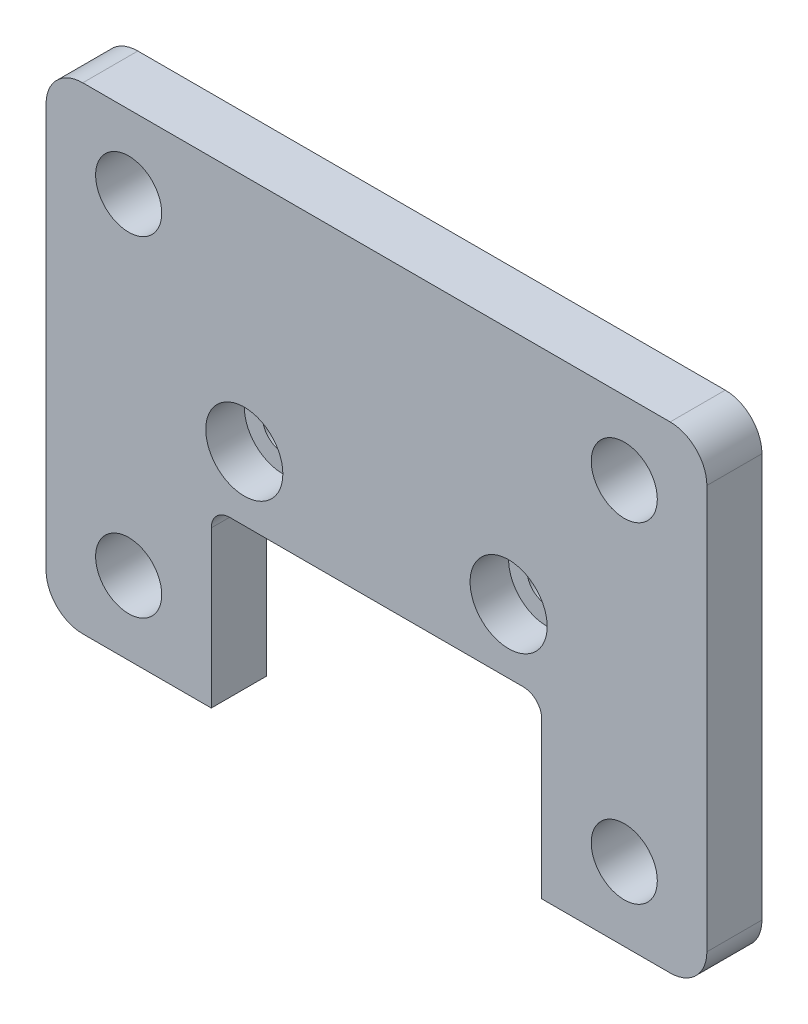
ISO-10303-21;
HEADER;
FILE_DESCRIPTION(('STEP AP214'),'2;1');
FILE_NAME('part.step','',(''),(''),'','','');
FILE_SCHEMA(('AUTOMOTIVE_DESIGN { 1 0 10303 214 1 1 1 1 }'));
ENDSEC;
DATA;
#1=APPLICATION_CONTEXT('core data for automotive mechanical design processes');
#2=APPLICATION_PROTOCOL_DEFINITION('international standard','automotive_design',2000,#1);
#3=PRODUCT_CONTEXT('',#1,'mechanical');
#4=PRODUCT('Part','Part','',(#3));
#5=PRODUCT_RELATED_PRODUCT_CATEGORY('part','',(#4));
#6=PRODUCT_DEFINITION_FORMATION('','',#4);
#7=PRODUCT_DEFINITION_CONTEXT('part definition',#1,'design');
#8=PRODUCT_DEFINITION('design','',#6,#7);
#9=PRODUCT_DEFINITION_SHAPE('','',#8);
#10=(LENGTH_UNIT() NAMED_UNIT(*) SI_UNIT(.MILLI.,.METRE.));
#11=(NAMED_UNIT(*) PLANE_ANGLE_UNIT() SI_UNIT($,.RADIAN.));
#12=(NAMED_UNIT(*) SI_UNIT($,.STERADIAN.) SOLID_ANGLE_UNIT());
#13=UNCERTAINTY_MEASURE_WITH_UNIT(LENGTH_MEASURE(1.E-05),#10,'distance_accuracy_value','');
#14=(GEOMETRIC_REPRESENTATION_CONTEXT(3) GLOBAL_UNCERTAINTY_ASSIGNED_CONTEXT((#13)) GLOBAL_UNIT_ASSIGNED_CONTEXT((#10,
#11,#12)) REPRESENTATION_CONTEXT('',''));
#15=CARTESIAN_POINT('',(0.,0.,0.));
#16=DIRECTION('',(0.,0.,1.));
#17=DIRECTION('',(1.,0.,0.));
#18=AXIS2_PLACEMENT_3D('',#15,#16,#17);
#19=CARTESIAN_POINT('',(7.2,0.,8.));
#20=DIRECTION('',(0.,0.,-1.));
#21=DIRECTION('',(-1.,0.,0.));
#22=AXIS2_PLACEMENT_3D('',#19,#20,#21);
#23=CYLINDRICAL_SURFACE('',#22,1.1);
#24=CARTESIAN_POINT('',(7.2,0.,0.));
#25=DIRECTION('',(0.,0.,1.));
#26=DIRECTION('',(1.,0.,0.));
#27=AXIS2_PLACEMENT_3D('',#24,#25,#26);
#28=CIRCLE('',#27,1.1);
#29=CARTESIAN_POINT('',(8.3,0.,0.));
#30=VERTEX_POINT('',#29);
#31=EDGE_CURVE('E190',#30,#30,#28,.T.);
#32=ORIENTED_EDGE('',*,*,#31,.F.);
#33=EDGE_LOOP('',(#32));
#34=FACE_BOUND('',#33,.T.);
#35=CARTESIAN_POINT('',(7.2,0.,5.9));
#36=DIRECTION('',(0.,0.,1.));
#37=DIRECTION('',(1.,0.,0.));
#38=AXIS2_PLACEMENT_3D('',#35,#36,#37);
#39=CIRCLE('',#38,1.1);
#40=CARTESIAN_POINT('',(8.3,0.,5.9));
#41=VERTEX_POINT('',#40);
#42=EDGE_CURVE('E39',#41,#41,#39,.T.);
#43=ORIENTED_EDGE('',*,*,#42,.T.);
#44=EDGE_LOOP('',(#43));
#45=FACE_BOUND('',#44,.T.);
#46=ADVANCED_FACE('F35',(#34,#45),#23,.F.);
#47=CARTESIAN_POINT('',(-7.2,0.,8.));
#48=DIRECTION('',(0.,0.,-1.));
#49=DIRECTION('',(-1.,0.,0.));
#50=AXIS2_PLACEMENT_3D('',#47,#48,#49);
#51=CYLINDRICAL_SURFACE('',#50,1.1);
#52=CARTESIAN_POINT('',(-7.2,0.,0.));
#53=DIRECTION('',(0.,0.,1.));
#54=DIRECTION('',(1.,0.,0.));
#55=AXIS2_PLACEMENT_3D('',#52,#53,#54);
#56=CIRCLE('',#55,1.1);
#57=CARTESIAN_POINT('',(-6.1,0.,0.));
#58=VERTEX_POINT('',#57);
#59=EDGE_CURVE('E209',#58,#58,#56,.T.);
#60=ORIENTED_EDGE('',*,*,#59,.F.);
#61=EDGE_LOOP('',(#60));
#62=FACE_BOUND('',#61,.T.);
#63=CARTESIAN_POINT('',(-7.2,0.,5.9));
#64=DIRECTION('',(0.,0.,1.));
#65=DIRECTION('',(1.,0.,0.));
#66=AXIS2_PLACEMENT_3D('',#63,#64,#65);
#67=CIRCLE('',#66,1.1);
#68=CARTESIAN_POINT('',(-6.1,0.,5.9));
#69=VERTEX_POINT('',#68);
#70=EDGE_CURVE('E184',#69,#69,#67,.T.);
#71=ORIENTED_EDGE('',*,*,#70,.T.);
#72=EDGE_LOOP('',(#71));
#73=FACE_BOUND('',#72,.T.);
#74=ADVANCED_FACE('F351',(#62,#73),#51,.F.);
#75=CARTESIAN_POINT('',(-16.,-13.,8.));
#76=DIRECTION('',(0.,1.,0.));
#77=DIRECTION('',(0.,0.,1.));
#78=AXIS2_PLACEMENT_3D('',#75,#76,#77);
#79=PLANE('',#78);
#80=DIRECTION('',(0.,0.,1.));
#81=VECTOR('',#80,1.);
#82=CARTESIAN_POINT('',(9.,-13.,8.));
#83=LINE('',#82,#81);
#84=CARTESIAN_POINT('',(9.,-13.,5.));
#85=VERTEX_POINT('',#84);
#86=CARTESIAN_POINT('',(9.,-13.,8.));
#87=VERTEX_POINT('',#86);
#88=EDGE_CURVE('E151',#85,#87,#83,.T.);
#89=ORIENTED_EDGE('',*,*,#88,.F.);
#90=DIRECTION('',(1.,0.,0.));
#91=VECTOR('',#90,1.);
#92=CARTESIAN_POINT('',(-16.,-13.,5.));
#93=LINE('',#92,#91);
#94=CARTESIAN_POINT('',(16.,-13.,5.));
#95=VERTEX_POINT('',#94);
#96=EDGE_CURVE('E150',#85,#95,#93,.T.);
#97=ORIENTED_EDGE('',*,*,#96,.T.);
#98=DIRECTION('',(0.,0.,-1.));
#99=VECTOR('',#98,1.);
#100=CARTESIAN_POINT('',(16.,-13.,8.));
#101=LINE('',#100,#99);
#102=CARTESIAN_POINT('',(16.,-13.,8.));
#103=VERTEX_POINT('',#102);
#104=EDGE_CURVE('E175',#103,#95,#101,.T.);
#105=ORIENTED_EDGE('',*,*,#104,.F.);
#106=DIRECTION('',(1.,0.,0.));
#107=VECTOR('',#106,1.);
#108=CARTESIAN_POINT('',(-16.,-13.,8.));
#109=LINE('',#108,#107);
#110=EDGE_CURVE('E273',#87,#103,#109,.T.);
#111=ORIENTED_EDGE('',*,*,#110,.F.);
#112=EDGE_LOOP('',(#89,#97,#105,#111));
#113=FACE_BOUND('',#112,.T.);
#114=ADVANCED_FACE('F339',(#113),#79,.F.);
#115=DIRECTION('',(0.,0.,-1.));
#116=VECTOR('',#115,1.);
#117=CARTESIAN_POINT('',(-9.,-13.,8.));
#118=LINE('',#117,#116);
#119=CARTESIAN_POINT('',(-9.,-13.,8.));
#120=VERTEX_POINT('',#119);
#121=CARTESIAN_POINT('',(-9.,-13.,5.));
#122=VERTEX_POINT('',#121);
#123=EDGE_CURVE('E52',#120,#122,#118,.T.);
#124=ORIENTED_EDGE('',*,*,#123,.F.);
#125=CARTESIAN_POINT('',(-16.,-13.,8.));
#126=VERTEX_POINT('',#125);
#127=EDGE_CURVE('E102',#126,#120,#109,.T.);
#128=ORIENTED_EDGE('',*,*,#127,.F.);
#129=DIRECTION('',(0.,0.,-1.));
#130=VECTOR('',#129,1.);
#131=CARTESIAN_POINT('',(-16.,-13.,8.));
#132=LINE('',#131,#130);
#133=CARTESIAN_POINT('',(-16.,-13.,5.));
#134=VERTEX_POINT('',#133);
#135=EDGE_CURVE('E178',#126,#134,#132,.T.);
#136=ORIENTED_EDGE('',*,*,#135,.T.);
#137=EDGE_CURVE('E152',#134,#122,#93,.T.);
#138=ORIENTED_EDGE('',*,*,#137,.T.);
#139=EDGE_LOOP('',(#124,#128,#136,#138));
#140=FACE_BOUND('',#139,.T.);
#141=ADVANCED_FACE('F409',(#140),#79,.F.);
#142=CARTESIAN_POINT('',(-16.,-11.,8.));
#143=DIRECTION('',(0.,0.,1.));
#144=DIRECTION('',(1.,0.,0.));
#145=AXIS2_PLACEMENT_3D('',#142,#143,#144);
#146=PLANE('',#145);
#147=CARTESIAN_POINT('',(-13.5,9.,8.));
#148=DIRECTION('',(0.,0.,1.));
#149=DIRECTION('',(1.,0.,0.));
#150=AXIS2_PLACEMENT_3D('',#147,#148,#149);
#151=CIRCLE('',#150,1.8);
#152=CARTESIAN_POINT('',(-11.7,9.,8.));
#153=VERTEX_POINT('',#152);
#154=EDGE_CURVE('E655',#153,#153,#151,.T.);
#155=ORIENTED_EDGE('',*,*,#154,.F.);
#156=EDGE_LOOP('',(#155));
#157=FACE_BOUND('',#156,.T.);
#158=CARTESIAN_POINT('',(13.5,-9.,8.));
#159=DIRECTION('',(0.,0.,1.));
#160=DIRECTION('',(1.,0.,0.));
#161=AXIS2_PLACEMENT_3D('',#158,#159,#160);
#162=CIRCLE('',#161,1.8);
#163=CARTESIAN_POINT('',(15.3,-9.,8.));
#164=VERTEX_POINT('',#163);
#165=EDGE_CURVE('E659',#164,#164,#162,.T.);
#166=ORIENTED_EDGE('',*,*,#165,.F.);
#167=EDGE_LOOP('',(#166));
#168=FACE_BOUND('',#167,.T.);
#169=CARTESIAN_POINT('',(13.5,9.,8.));
#170=DIRECTION('',(0.,0.,1.));
#171=DIRECTION('',(1.,0.,0.));
#172=AXIS2_PLACEMENT_3D('',#169,#170,#171);
#173=CIRCLE('',#172,1.8);
#174=CARTESIAN_POINT('',(15.3,9.,8.));
#175=VERTEX_POINT('',#174);
#176=EDGE_CURVE('E668',#175,#175,#173,.T.);
#177=ORIENTED_EDGE('',*,*,#176,.F.);
#178=EDGE_LOOP('',(#177));
#179=FACE_BOUND('',#178,.T.);
#180=CARTESIAN_POINT('',(-13.5,-9.,8.));
#181=DIRECTION('',(0.,0.,1.));
#182=DIRECTION('',(1.,0.,0.));
#183=AXIS2_PLACEMENT_3D('',#180,#181,#182);
#184=CIRCLE('',#183,1.8);
#185=CARTESIAN_POINT('',(-11.7,-9.,8.));
#186=VERTEX_POINT('',#185);
#187=EDGE_CURVE('E208',#186,#186,#184,.T.);
#188=ORIENTED_EDGE('',*,*,#187,.F.);
#189=EDGE_LOOP('',(#188));
#190=FACE_BOUND('',#189,.T.);
#191=CARTESIAN_POINT('',(-7.2,0.,8.));
#192=DIRECTION('',(0.,0.,1.));
#193=DIRECTION('',(1.,0.,0.));
#194=AXIS2_PLACEMENT_3D('',#191,#192,#193);
#195=CIRCLE('',#194,2.1);
#196=CARTESIAN_POINT('',(-5.1,0.,8.));
#197=VERTEX_POINT('',#196);
#198=EDGE_CURVE('E186',#197,#197,#195,.T.);
#199=ORIENTED_EDGE('',*,*,#198,.F.);
#200=EDGE_LOOP('',(#199));
#201=FACE_BOUND('',#200,.T.);
#202=CARTESIAN_POINT('',(7.2,0.,8.));
#203=DIRECTION('',(0.,0.,1.));
#204=DIRECTION('',(1.,0.,0.));
#205=AXIS2_PLACEMENT_3D('',#202,#203,#204);
#206=CIRCLE('',#205,2.1);
#207=CARTESIAN_POINT('',(9.3,0.,8.));
#208=VERTEX_POINT('',#207);
#209=EDGE_CURVE('E197',#208,#208,#206,.T.);
#210=ORIENTED_EDGE('',*,*,#209,.F.);
#211=EDGE_LOOP('',(#210));
#212=FACE_BOUND('',#211,.T.);
#213=CARTESIAN_POINT('',(8.,-4.5,8.));
#214=DIRECTION('',(0.,0.,1.));
#215=DIRECTION('',(1.,0.,0.));
#216=AXIS2_PLACEMENT_3D('',#213,#214,#215);
#217=CIRCLE('',#216,0.999999999999996);
#218=CARTESIAN_POINT('',(9.,-4.5,8.));
#219=VERTEX_POINT('',#218);
#220=CARTESIAN_POINT('',(8.,-3.5,8.));
#221=VERTEX_POINT('',#220);
#222=EDGE_CURVE('E236',#219,#221,#217,.T.);
#223=ORIENTED_EDGE('',*,*,#222,.F.);
#224=DIRECTION('',(0.,1.,0.));
#225=VECTOR('',#224,1.);
#226=CARTESIAN_POINT('',(9.,-19.,8.));
#227=LINE('',#226,#225);
#228=EDGE_CURVE('E233',#87,#219,#227,.T.);
#229=ORIENTED_EDGE('',*,*,#228,.F.);
#230=ORIENTED_EDGE('',*,*,#110,.T.);
#231=CARTESIAN_POINT('',(16.,-11.,8.));
#232=DIRECTION('',(0.,0.,1.));
#233=DIRECTION('',(1.,0.,0.));
#234=AXIS2_PLACEMENT_3D('',#231,#232,#233);
#235=CIRCLE('',#234,1.99999999999999);
#236=CARTESIAN_POINT('',(18.,-11.,8.));
#237=VERTEX_POINT('',#236);
#238=EDGE_CURVE('E275',#103,#237,#235,.T.);
#239=ORIENTED_EDGE('',*,*,#238,.T.);
#240=DIRECTION('',(0.,1.,0.));
#241=VECTOR('',#240,1.);
#242=CARTESIAN_POINT('',(18.,-11.,8.));
#243=LINE('',#242,#241);
#244=CARTESIAN_POINT('',(18.,11.,8.));
#245=VERTEX_POINT('',#244);
#246=EDGE_CURVE('E277',#237,#245,#243,.T.);
#247=ORIENTED_EDGE('',*,*,#246,.T.);
#248=CARTESIAN_POINT('',(16.,11.,8.));
#249=DIRECTION('',(0.,0.,1.));
#250=DIRECTION('',(1.,0.,0.));
#251=AXIS2_PLACEMENT_3D('',#248,#249,#250);
#252=CIRCLE('',#251,1.99999999999999);
#253=CARTESIAN_POINT('',(16.,13.,8.));
#254=VERTEX_POINT('',#253);
#255=EDGE_CURVE('E126',#245,#254,#252,.T.);
#256=ORIENTED_EDGE('',*,*,#255,.T.);
#257=DIRECTION('',(-1.,0.,0.));
#258=VECTOR('',#257,1.);
#259=CARTESIAN_POINT('',(16.,13.,8.));
#260=LINE('',#259,#258);
#261=CARTESIAN_POINT('',(-16.,13.,8.));
#262=VERTEX_POINT('',#261);
#263=EDGE_CURVE('E118',#254,#262,#260,.T.);
#264=ORIENTED_EDGE('',*,*,#263,.T.);
#265=CARTESIAN_POINT('',(-16.,11.,8.));
#266=DIRECTION('',(0.,0.,1.));
#267=DIRECTION('',(1.,0.,0.));
#268=AXIS2_PLACEMENT_3D('',#265,#266,#267);
#269=CIRCLE('',#268,1.99999999999999);
#270=CARTESIAN_POINT('',(-18.,11.,8.));
#271=VERTEX_POINT('',#270);
#272=EDGE_CURVE('E123',#262,#271,#269,.T.);
#273=ORIENTED_EDGE('',*,*,#272,.T.);
#274=DIRECTION('',(0.,-1.,0.));
#275=VECTOR('',#274,1.);
#276=CARTESIAN_POINT('',(-18.,11.,8.));
#277=LINE('',#276,#275);
#278=CARTESIAN_POINT('',(-18.,-11.,8.));
#279=VERTEX_POINT('',#278);
#280=EDGE_CURVE('E61',#271,#279,#277,.T.);
#281=ORIENTED_EDGE('',*,*,#280,.T.);
#282=CARTESIAN_POINT('',(-16.,-11.,8.));
#283=DIRECTION('',(0.,0.,1.));
#284=DIRECTION('',(1.,0.,0.));
#285=AXIS2_PLACEMENT_3D('',#282,#283,#284);
#286=CIRCLE('',#285,1.99999999999999);
#287=EDGE_CURVE('E165',#279,#126,#286,.T.);
#288=ORIENTED_EDGE('',*,*,#287,.T.);
#289=ORIENTED_EDGE('',*,*,#127,.T.);
#290=DIRECTION('',(0.,-1.,0.));
#291=VECTOR('',#290,1.);
#292=CARTESIAN_POINT('',(-9.,-4.5,8.));
#293=LINE('',#292,#291);
#294=CARTESIAN_POINT('',(-9.,-4.5,8.));
#295=VERTEX_POINT('',#294);
#296=EDGE_CURVE('E246',#295,#120,#293,.T.);
#297=ORIENTED_EDGE('',*,*,#296,.F.);
#298=CARTESIAN_POINT('',(-8.,-4.5,8.));
#299=DIRECTION('',(0.,0.,1.));
#300=DIRECTION('',(1.,0.,0.));
#301=AXIS2_PLACEMENT_3D('',#298,#299,#300);
#302=CIRCLE('',#301,0.999999999999997);
#303=CARTESIAN_POINT('',(-8.,-3.5,8.));
#304=VERTEX_POINT('',#303);
#305=EDGE_CURVE('E243',#304,#295,#302,.T.);
#306=ORIENTED_EDGE('',*,*,#305,.F.);
#307=DIRECTION('',(-1.,0.,0.));
#308=VECTOR('',#307,1.);
#309=CARTESIAN_POINT('',(8.,-3.5,8.));
#310=LINE('',#309,#308);
#311=EDGE_CURVE('E240',#221,#304,#310,.T.);
#312=ORIENTED_EDGE('',*,*,#311,.F.);
#313=EDGE_LOOP('',(#223,#229,#230,#239,#247,#256,#264,#273,#281,#288,#289,#297,#306,#312));
#314=FACE_BOUND('',#313,.T.);
#315=ADVANCED_FACE('F121',(#157,#168,#179,#190,#201,#212,#314),#146,.T.);
#316=CARTESIAN_POINT('',(-16.,-11.,5.));
#317=DIRECTION('',(0.,0.,1.));
#318=DIRECTION('',(1.,0.,0.));
#319=AXIS2_PLACEMENT_3D('',#316,#317,#318);
#320=PLANE('',#319);
#321=CARTESIAN_POINT('',(-13.5,9.,5.));
#322=DIRECTION('',(0.,0.,1.));
#323=DIRECTION('',(1.,0.,0.));
#324=AXIS2_PLACEMENT_3D('',#321,#322,#323);
#325=CIRCLE('',#324,1.8);
#326=CARTESIAN_POINT('',(-11.7,9.,5.));
#327=VERTEX_POINT('',#326);
#328=EDGE_CURVE('E658',#327,#327,#325,.T.);
#329=ORIENTED_EDGE('',*,*,#328,.T.);
#330=EDGE_LOOP('',(#329));
#331=FACE_BOUND('',#330,.T.);
#332=CARTESIAN_POINT('',(13.5,-9.,5.));
#333=DIRECTION('',(0.,0.,1.));
#334=DIRECTION('',(1.,0.,0.));
#335=AXIS2_PLACEMENT_3D('',#332,#333,#334);
#336=CIRCLE('',#335,1.8);
#337=CARTESIAN_POINT('',(15.3,-9.,5.));
#338=VERTEX_POINT('',#337);
#339=EDGE_CURVE('E663',#338,#338,#336,.T.);
#340=ORIENTED_EDGE('',*,*,#339,.T.);
#341=EDGE_LOOP('',(#340));
#342=FACE_BOUND('',#341,.T.);
#343=CARTESIAN_POINT('',(13.5,9.,5.));
#344=DIRECTION('',(0.,0.,1.));
#345=DIRECTION('',(1.,0.,0.));
#346=AXIS2_PLACEMENT_3D('',#343,#344,#345);
#347=CIRCLE('',#346,1.8);
#348=CARTESIAN_POINT('',(15.3,9.,5.));
#349=VERTEX_POINT('',#348);
#350=EDGE_CURVE('E695',#349,#349,#347,.T.);
#351=ORIENTED_EDGE('',*,*,#350,.T.);
#352=EDGE_LOOP('',(#351));
#353=FACE_BOUND('',#352,.T.);
#354=CARTESIAN_POINT('',(-13.5,-9.,5.));
#355=DIRECTION('',(0.,0.,1.));
#356=DIRECTION('',(1.,0.,0.));
#357=AXIS2_PLACEMENT_3D('',#354,#355,#356);
#358=CIRCLE('',#357,1.8);
#359=CARTESIAN_POINT('',(-11.7,-9.,5.));
#360=VERTEX_POINT('',#359);
#361=EDGE_CURVE('E200',#360,#360,#358,.T.);
#362=ORIENTED_EDGE('',*,*,#361,.T.);
#363=EDGE_LOOP('',(#362));
#364=FACE_BOUND('',#363,.T.);
#365=CARTESIAN_POINT('',(7.2,0.,5.));
#366=DIRECTION('',(0.,0.,1.));
#367=DIRECTION('',(1.,0.,0.));
#368=AXIS2_PLACEMENT_3D('',#365,#366,#367);
#369=CIRCLE('',#368,2.75);
#370=CARTESIAN_POINT('',(9.95,0.,5.));
#371=VERTEX_POINT('',#370);
#372=EDGE_CURVE('E11',#371,#371,#369,.F.);
#373=ORIENTED_EDGE('',*,*,#372,.F.);
#374=EDGE_LOOP('',(#373));
#375=FACE_BOUND('',#374,.T.);
#376=CARTESIAN_POINT('',(-7.2,0.,5.));
#377=DIRECTION('',(0.,0.,1.));
#378=DIRECTION('',(1.,0.,0.));
#379=AXIS2_PLACEMENT_3D('',#376,#377,#378);
#380=CIRCLE('',#379,2.75);
#381=CARTESIAN_POINT('',(-4.45,0.,5.));
#382=VERTEX_POINT('',#381);
#383=EDGE_CURVE('E44',#382,#382,#380,.F.);
#384=ORIENTED_EDGE('',*,*,#383,.F.);
#385=EDGE_LOOP('',(#384));
#386=FACE_BOUND('',#385,.T.);
#387=DIRECTION('',(0.,-1.,0.));
#388=VECTOR('',#387,1.);
#389=CARTESIAN_POINT('',(9.,-11.,5.));
#390=LINE('',#389,#388);
#391=CARTESIAN_POINT('',(9.,-4.5,5.));
#392=VERTEX_POINT('',#391);
#393=EDGE_CURVE('E180',#392,#85,#390,.T.);
#394=ORIENTED_EDGE('',*,*,#393,.F.);
#395=CARTESIAN_POINT('',(8.,-4.5,5.));
#396=DIRECTION('',(0.,0.,1.));
#397=DIRECTION('',(1.,0.,0.));
#398=AXIS2_PLACEMENT_3D('',#395,#396,#397);
#399=CIRCLE('',#398,0.999999999999996);
#400=CARTESIAN_POINT('',(8.,-3.5,5.));
#401=VERTEX_POINT('',#400);
#402=EDGE_CURVE('E232',#392,#401,#399,.T.);
#403=ORIENTED_EDGE('',*,*,#402,.T.);
#404=DIRECTION('',(-1.,0.,0.));
#405=VECTOR('',#404,1.);
#406=CARTESIAN_POINT('',(8.,-3.5,5.));
#407=LINE('',#406,#405);
#408=CARTESIAN_POINT('',(-8.,-3.5,5.));
#409=VERTEX_POINT('',#408);
#410=EDGE_CURVE('E251',#401,#409,#407,.T.);
#411=ORIENTED_EDGE('',*,*,#410,.T.);
#412=CARTESIAN_POINT('',(-8.,-4.5,5.));
#413=DIRECTION('',(0.,0.,1.));
#414=DIRECTION('',(1.,0.,0.));
#415=AXIS2_PLACEMENT_3D('',#412,#413,#414);
#416=CIRCLE('',#415,0.999999999999997);
#417=CARTESIAN_POINT('',(-9.,-4.5,5.));
#418=VERTEX_POINT('',#417);
#419=EDGE_CURVE('E254',#409,#418,#416,.T.);
#420=ORIENTED_EDGE('',*,*,#419,.T.);
#421=DIRECTION('',(0.,-1.,0.));
#422=VECTOR('',#421,1.);
#423=CARTESIAN_POINT('',(-9.,-4.5,5.));
#424=LINE('',#423,#422);
#425=EDGE_CURVE('E237',#418,#122,#424,.T.);
#426=ORIENTED_EDGE('',*,*,#425,.T.);
#427=ORIENTED_EDGE('',*,*,#137,.F.);
#428=CARTESIAN_POINT('',(-16.,-11.,5.));
#429=DIRECTION('',(0.,0.,1.));
#430=DIRECTION('',(1.,0.,0.));
#431=AXIS2_PLACEMENT_3D('',#428,#429,#430);
#432=CIRCLE('',#431,1.99999999999999);
#433=CARTESIAN_POINT('',(-18.,-11.,5.));
#434=VERTEX_POINT('',#433);
#435=EDGE_CURVE('E147',#434,#134,#432,.T.);
#436=ORIENTED_EDGE('',*,*,#435,.F.);
#437=DIRECTION('',(0.,-1.,0.));
#438=VECTOR('',#437,1.);
#439=CARTESIAN_POINT('',(-18.,11.,5.));
#440=LINE('',#439,#438);
#441=CARTESIAN_POINT('',(-18.,11.,5.));
#442=VERTEX_POINT('',#441);
#443=EDGE_CURVE('E94',#442,#434,#440,.T.);
#444=ORIENTED_EDGE('',*,*,#443,.F.);
#445=CARTESIAN_POINT('',(-16.,11.,5.));
#446=DIRECTION('',(0.,0.,1.));
#447=DIRECTION('',(1.,0.,0.));
#448=AXIS2_PLACEMENT_3D('',#445,#446,#447);
#449=CIRCLE('',#448,1.99999999999999);
#450=CARTESIAN_POINT('',(-16.,13.,5.));
#451=VERTEX_POINT('',#450);
#452=EDGE_CURVE('E162',#451,#442,#449,.T.);
#453=ORIENTED_EDGE('',*,*,#452,.F.);
#454=DIRECTION('',(-1.,0.,0.));
#455=VECTOR('',#454,1.);
#456=CARTESIAN_POINT('',(16.,13.,5.));
#457=LINE('',#456,#455);
#458=CARTESIAN_POINT('',(16.,13.,5.));
#459=VERTEX_POINT('',#458);
#460=EDGE_CURVE('E135',#459,#451,#457,.T.);
#461=ORIENTED_EDGE('',*,*,#460,.F.);
#462=CARTESIAN_POINT('',(16.,11.,5.));
#463=DIRECTION('',(0.,0.,1.));
#464=DIRECTION('',(1.,0.,0.));
#465=AXIS2_PLACEMENT_3D('',#462,#463,#464);
#466=CIRCLE('',#465,1.99999999999999);
#467=CARTESIAN_POINT('',(18.,11.,5.));
#468=VERTEX_POINT('',#467);
#469=EDGE_CURVE('E159',#468,#459,#466,.T.);
#470=ORIENTED_EDGE('',*,*,#469,.F.);
#471=DIRECTION('',(0.,1.,0.));
#472=VECTOR('',#471,1.);
#473=CARTESIAN_POINT('',(18.,-11.,5.));
#474=LINE('',#473,#472);
#475=CARTESIAN_POINT('',(18.,-11.,5.));
#476=VERTEX_POINT('',#475);
#477=EDGE_CURVE('E157',#476,#468,#474,.T.);
#478=ORIENTED_EDGE('',*,*,#477,.F.);
#479=CARTESIAN_POINT('',(16.,-11.,5.));
#480=DIRECTION('',(0.,0.,1.));
#481=DIRECTION('',(1.,0.,0.));
#482=AXIS2_PLACEMENT_3D('',#479,#480,#481);
#483=CIRCLE('',#482,1.99999999999999);
#484=EDGE_CURVE('E155',#95,#476,#483,.T.);
#485=ORIENTED_EDGE('',*,*,#484,.F.);
#486=ORIENTED_EDGE('',*,*,#96,.F.);
#487=EDGE_LOOP('',(#394,#403,#411,#420,#426,#427,#436,#444,#453,#461,#470,#478,#485,#486));
#488=FACE_BOUND('',#487,.T.);
#489=ADVANCED_FACE('F290',(#331,#342,#353,#364,#375,#386,#488),#320,.F.);
#490=CARTESIAN_POINT('',(-16.,-11.,8.));
#491=DIRECTION('',(0.,0.,-1.));
#492=DIRECTION('',(-1.,0.,0.));
#493=AXIS2_PLACEMENT_3D('',#490,#491,#492);
#494=CYLINDRICAL_SURFACE('',#493,1.99999999999999);
#495=ORIENTED_EDGE('',*,*,#435,.T.);
#496=ORIENTED_EDGE('',*,*,#135,.F.);
#497=ORIENTED_EDGE('',*,*,#287,.F.);
#498=DIRECTION('',(0.,0.,-1.));
#499=VECTOR('',#498,1.);
#500=CARTESIAN_POINT('',(-18.,-11.,8.));
#501=LINE('',#500,#499);
#502=EDGE_CURVE('E143',#279,#434,#501,.T.);
#503=ORIENTED_EDGE('',*,*,#502,.T.);
#504=EDGE_LOOP('',(#495,#496,#497,#503));
#505=FACE_BOUND('',#504,.T.);
#506=ADVANCED_FACE('F37',(#505),#494,.T.);
#507=CARTESIAN_POINT('',(16.,-11.,8.));
#508=DIRECTION('',(0.,0.,-1.));
#509=DIRECTION('',(-1.,0.,0.));
#510=AXIS2_PLACEMENT_3D('',#507,#508,#509);
#511=CYLINDRICAL_SURFACE('',#510,1.99999999999999);
#512=ORIENTED_EDGE('',*,*,#484,.T.);
#513=DIRECTION('',(0.,0.,-1.));
#514=VECTOR('',#513,1.);
#515=CARTESIAN_POINT('',(18.,-11.,8.));
#516=LINE('',#515,#514);
#517=EDGE_CURVE('E172',#237,#476,#516,.T.);
#518=ORIENTED_EDGE('',*,*,#517,.F.);
#519=ORIENTED_EDGE('',*,*,#238,.F.);
#520=ORIENTED_EDGE('',*,*,#104,.T.);
#521=EDGE_LOOP('',(#512,#518,#519,#520));
#522=FACE_BOUND('',#521,.T.);
#523=ADVANCED_FACE('F342',(#522),#511,.T.);
#524=CARTESIAN_POINT('',(18.,-11.,8.));
#525=DIRECTION('',(-1.,0.,0.));
#526=DIRECTION('',(0.,0.,1.));
#527=AXIS2_PLACEMENT_3D('',#524,#525,#526);
#528=PLANE('',#527);
#529=ORIENTED_EDGE('',*,*,#477,.T.);
#530=DIRECTION('',(0.,0.,-1.));
#531=VECTOR('',#530,1.);
#532=CARTESIAN_POINT('',(18.,11.,8.));
#533=LINE('',#532,#531);
#534=EDGE_CURVE('E169',#245,#468,#533,.T.);
#535=ORIENTED_EDGE('',*,*,#534,.F.);
#536=ORIENTED_EDGE('',*,*,#246,.F.);
#537=ORIENTED_EDGE('',*,*,#517,.T.);
#538=EDGE_LOOP('',(#529,#535,#536,#537));
#539=FACE_BOUND('',#538,.T.);
#540=ADVANCED_FACE('F283',(#539),#528,.F.);
#541=CARTESIAN_POINT('',(16.,11.,8.));
#542=DIRECTION('',(0.,0.,-1.));
#543=DIRECTION('',(-1.,0.,0.));
#544=AXIS2_PLACEMENT_3D('',#541,#542,#543);
#545=CYLINDRICAL_SURFACE('',#544,1.99999999999999);
#546=ORIENTED_EDGE('',*,*,#469,.T.);
#547=DIRECTION('',(0.,0.,-1.));
#548=VECTOR('',#547,1.);
#549=CARTESIAN_POINT('',(16.,13.,8.));
#550=LINE('',#549,#548);
#551=EDGE_CURVE('E138',#254,#459,#550,.T.);
#552=ORIENTED_EDGE('',*,*,#551,.F.);
#553=ORIENTED_EDGE('',*,*,#255,.F.);
#554=ORIENTED_EDGE('',*,*,#534,.T.);
#555=EDGE_LOOP('',(#546,#552,#553,#554));
#556=FACE_BOUND('',#555,.T.);
#557=ADVANCED_FACE('F287',(#556),#545,.T.);
#558=CARTESIAN_POINT('',(16.,13.,8.));
#559=DIRECTION('',(0.,-1.,0.));
#560=DIRECTION('',(0.,0.,-1.));
#561=AXIS2_PLACEMENT_3D('',#558,#559,#560);
#562=PLANE('',#561);
#563=ORIENTED_EDGE('',*,*,#460,.T.);
#564=DIRECTION('',(0.,0.,-1.));
#565=VECTOR('',#564,1.);
#566=CARTESIAN_POINT('',(-16.,13.,8.));
#567=LINE('',#566,#565);
#568=EDGE_CURVE('E132',#262,#451,#567,.T.);
#569=ORIENTED_EDGE('',*,*,#568,.F.);
#570=ORIENTED_EDGE('',*,*,#263,.F.);
#571=ORIENTED_EDGE('',*,*,#551,.T.);
#572=EDGE_LOOP('',(#563,#569,#570,#571));
#573=FACE_BOUND('',#572,.T.);
#574=ADVANCED_FACE('F133',(#573),#562,.F.);
#575=CARTESIAN_POINT('',(-16.,11.,8.));
#576=DIRECTION('',(0.,0.,-1.));
#577=DIRECTION('',(-1.,0.,0.));
#578=AXIS2_PLACEMENT_3D('',#575,#576,#577);
#579=CYLINDRICAL_SURFACE('',#578,1.99999999999999);
#580=ORIENTED_EDGE('',*,*,#452,.T.);
#581=DIRECTION('',(0.,0.,-1.));
#582=VECTOR('',#581,1.);
#583=CARTESIAN_POINT('',(-18.,11.,8.));
#584=LINE('',#583,#582);
#585=EDGE_CURVE('E139',#271,#442,#584,.T.);
#586=ORIENTED_EDGE('',*,*,#585,.F.);
#587=ORIENTED_EDGE('',*,*,#272,.F.);
#588=ORIENTED_EDGE('',*,*,#568,.T.);
#589=EDGE_LOOP('',(#580,#586,#587,#588));
#590=FACE_BOUND('',#589,.T.);
#591=ADVANCED_FACE('F141',(#590),#579,.T.);
#592=CARTESIAN_POINT('',(-18.,11.,8.));
#593=DIRECTION('',(1.,0.,0.));
#594=DIRECTION('',(0.,0.,-1.));
#595=AXIS2_PLACEMENT_3D('',#592,#593,#594);
#596=PLANE('',#595);
#597=ORIENTED_EDGE('',*,*,#443,.T.);
#598=ORIENTED_EDGE('',*,*,#502,.F.);
#599=ORIENTED_EDGE('',*,*,#280,.F.);
#600=ORIENTED_EDGE('',*,*,#585,.T.);
#601=EDGE_LOOP('',(#597,#598,#599,#600));
#602=FACE_BOUND('',#601,.T.);
#603=ADVANCED_FACE('F292',(#602),#596,.F.);
#604=CARTESIAN_POINT('',(9.,-19.,8.));
#605=DIRECTION('',(-1.,0.,0.));
#606=DIRECTION('',(0.,0.,1.));
#607=AXIS2_PLACEMENT_3D('',#604,#605,#606);
#608=PLANE('',#607);
#609=ORIENTED_EDGE('',*,*,#88,.T.);
#610=ORIENTED_EDGE('',*,*,#228,.T.);
#611=DIRECTION('',(0.,0.,-1.));
#612=VECTOR('',#611,1.);
#613=CARTESIAN_POINT('',(9.,-4.5,8.));
#614=LINE('',#613,#612);
#615=EDGE_CURVE('E266',#219,#392,#614,.T.);
#616=ORIENTED_EDGE('',*,*,#615,.T.);
#617=ORIENTED_EDGE('',*,*,#393,.T.);
#618=EDGE_LOOP('',(#609,#610,#616,#617));
#619=FACE_BOUND('',#618,.T.);
#620=ADVANCED_FACE('F321',(#619),#608,.T.);
#621=CARTESIAN_POINT('',(-9.,-4.5,8.));
#622=DIRECTION('',(1.,0.,0.));
#623=DIRECTION('',(0.,0.,-1.));
#624=AXIS2_PLACEMENT_3D('',#621,#622,#623);
#625=PLANE('',#624);
#626=ORIENTED_EDGE('',*,*,#123,.T.);
#627=ORIENTED_EDGE('',*,*,#425,.F.);
#628=DIRECTION('',(0.,0.,-1.));
#629=VECTOR('',#628,1.);
#630=CARTESIAN_POINT('',(-9.,-4.5,8.));
#631=LINE('',#630,#629);
#632=EDGE_CURVE('E248',#295,#418,#631,.T.);
#633=ORIENTED_EDGE('',*,*,#632,.F.);
#634=ORIENTED_EDGE('',*,*,#296,.T.);
#635=EDGE_LOOP('',(#626,#627,#633,#634));
#636=FACE_BOUND('',#635,.T.);
#637=ADVANCED_FACE('F396',(#636),#625,.T.);
#638=CARTESIAN_POINT('',(8.,-4.5,8.));
#639=DIRECTION('',(0.,0.,-1.));
#640=DIRECTION('',(-1.,0.,0.));
#641=AXIS2_PLACEMENT_3D('',#638,#639,#640);
#642=CYLINDRICAL_SURFACE('',#641,0.999999999999996);
#643=ORIENTED_EDGE('',*,*,#402,.F.);
#644=ORIENTED_EDGE('',*,*,#615,.F.);
#645=ORIENTED_EDGE('',*,*,#222,.T.);
#646=DIRECTION('',(0.,0.,-1.));
#647=VECTOR('',#646,1.);
#648=CARTESIAN_POINT('',(8.,-3.5,8.));
#649=LINE('',#648,#647);
#650=EDGE_CURVE('E263',#221,#401,#649,.T.);
#651=ORIENTED_EDGE('',*,*,#650,.T.);
#652=EDGE_LOOP('',(#643,#644,#645,#651));
#653=FACE_BOUND('',#652,.T.);
#654=ADVANCED_FACE('F326',(#653),#642,.F.);
#655=CARTESIAN_POINT('',(8.,-3.5,8.));
#656=DIRECTION('',(0.,-1.,0.));
#657=DIRECTION('',(0.,0.,-1.));
#658=AXIS2_PLACEMENT_3D('',#655,#656,#657);
#659=PLANE('',#658);
#660=ORIENTED_EDGE('',*,*,#410,.F.);
#661=ORIENTED_EDGE('',*,*,#650,.F.);
#662=ORIENTED_EDGE('',*,*,#311,.T.);
#663=DIRECTION('',(0.,0.,-1.));
#664=VECTOR('',#663,1.);
#665=CARTESIAN_POINT('',(-8.,-3.5,8.));
#666=LINE('',#665,#664);
#667=EDGE_CURVE('E260',#304,#409,#666,.T.);
#668=ORIENTED_EDGE('',*,*,#667,.T.);
#669=EDGE_LOOP('',(#660,#661,#662,#668));
#670=FACE_BOUND('',#669,.T.);
#671=ADVANCED_FACE('F332',(#670),#659,.T.);
#672=CARTESIAN_POINT('',(-8.,-4.5,8.));
#673=DIRECTION('',(0.,0.,-1.));
#674=DIRECTION('',(-1.,0.,0.));
#675=AXIS2_PLACEMENT_3D('',#672,#673,#674);
#676=CYLINDRICAL_SURFACE('',#675,0.999999999999997);
#677=ORIENTED_EDGE('',*,*,#419,.F.);
#678=ORIENTED_EDGE('',*,*,#667,.F.);
#679=ORIENTED_EDGE('',*,*,#305,.T.);
#680=ORIENTED_EDGE('',*,*,#632,.T.);
#681=EDGE_LOOP('',(#677,#678,#679,#680));
#682=FACE_BOUND('',#681,.T.);
#683=ADVANCED_FACE('F335',(#682),#676,.F.);
#684=CARTESIAN_POINT('',(-7.2,0.,5.));
#685=DIRECTION('',(0.,0.,-1.));
#686=DIRECTION('',(-1.,0.,0.));
#687=AXIS2_PLACEMENT_3D('',#684,#685,#686);
#688=CYLINDRICAL_SURFACE('',#687,2.75);
#689=ORIENTED_EDGE('',*,*,#383,.T.);
#690=EDGE_LOOP('',(#689));
#691=FACE_BOUND('',#690,.T.);
#692=CARTESIAN_POINT('',(-7.2,0.,3.));
#693=DIRECTION('',(0.,0.,1.));
#694=DIRECTION('',(1.,0.,0.));
#695=AXIS2_PLACEMENT_3D('',#692,#693,#694);
#696=CIRCLE('',#695,2.75);
#697=CARTESIAN_POINT('',(-4.45,0.,3.));
#698=VERTEX_POINT('',#697);
#699=EDGE_CURVE('E229',#698,#698,#696,.T.);
#700=ORIENTED_EDGE('',*,*,#699,.T.);
#701=EDGE_LOOP('',(#700));
#702=FACE_BOUND('',#701,.T.);
#703=ADVANCED_FACE('F391',(#691,#702),#688,.T.);
#704=CARTESIAN_POINT('',(-7.2,0.,3.));
#705=DIRECTION('',(0.,0.,1.));
#706=DIRECTION('',(1.,0.,0.));
#707=AXIS2_PLACEMENT_3D('',#704,#705,#706);
#708=PLANE('',#707);
#709=CARTESIAN_POINT('',(-7.2,0.,3.));
#710=DIRECTION('',(0.,0.,1.));
#711=DIRECTION('',(1.,0.,0.));
#712=AXIS2_PLACEMENT_3D('',#709,#710,#711);
#713=CIRCLE('',#712,2.);
#714=CARTESIAN_POINT('',(-5.2,0.,3.));
#715=VERTEX_POINT('',#714);
#716=EDGE_CURVE('E221',#715,#715,#713,.T.);
#717=ORIENTED_EDGE('',*,*,#716,.T.);
#718=EDGE_LOOP('',(#717));
#719=FACE_BOUND('',#718,.T.);
#720=ORIENTED_EDGE('',*,*,#699,.F.);
#721=EDGE_LOOP('',(#720));
#722=FACE_BOUND('',#721,.T.);
#723=ADVANCED_FACE('F387',(#719,#722),#708,.F.);
#724=CARTESIAN_POINT('',(7.2,0.,5.));
#725=DIRECTION('',(0.,0.,-1.));
#726=DIRECTION('',(-1.,0.,0.));
#727=AXIS2_PLACEMENT_3D('',#724,#725,#726);
#728=CYLINDRICAL_SURFACE('',#727,2.75);
#729=ORIENTED_EDGE('',*,*,#372,.T.);
#730=EDGE_LOOP('',(#729));
#731=FACE_BOUND('',#730,.T.);
#732=CARTESIAN_POINT('',(7.2,0.,3.));
#733=DIRECTION('',(0.,0.,1.));
#734=DIRECTION('',(1.,0.,0.));
#735=AXIS2_PLACEMENT_3D('',#732,#733,#734);
#736=CIRCLE('',#735,2.75);
#737=CARTESIAN_POINT('',(9.95,0.,3.));
#738=VERTEX_POINT('',#737);
#739=EDGE_CURVE('E224',#738,#738,#736,.T.);
#740=ORIENTED_EDGE('',*,*,#739,.T.);
#741=EDGE_LOOP('',(#740));
#742=FACE_BOUND('',#741,.T.);
#743=ADVANCED_FACE('F383',(#731,#742),#728,.T.);
#744=CARTESIAN_POINT('',(7.2,0.,3.));
#745=DIRECTION('',(0.,0.,1.));
#746=DIRECTION('',(1.,0.,0.));
#747=AXIS2_PLACEMENT_3D('',#744,#745,#746);
#748=PLANE('',#747);
#749=CARTESIAN_POINT('',(7.2,0.,3.));
#750=DIRECTION('',(0.,0.,1.));
#751=DIRECTION('',(1.,0.,0.));
#752=AXIS2_PLACEMENT_3D('',#749,#750,#751);
#753=CIRCLE('',#752,2.);
#754=CARTESIAN_POINT('',(9.2,0.,3.));
#755=VERTEX_POINT('',#754);
#756=EDGE_CURVE('E215',#755,#755,#753,.T.);
#757=ORIENTED_EDGE('',*,*,#756,.T.);
#758=EDGE_LOOP('',(#757));
#759=FACE_BOUND('',#758,.T.);
#760=ORIENTED_EDGE('',*,*,#739,.F.);
#761=EDGE_LOOP('',(#760));
#762=FACE_BOUND('',#761,.T.);
#763=ADVANCED_FACE('F379',(#759,#762),#748,.F.);
#764=CARTESIAN_POINT('',(-7.2,0.,3.));
#765=DIRECTION('',(0.,0.,-1.));
#766=DIRECTION('',(-1.,0.,0.));
#767=AXIS2_PLACEMENT_3D('',#764,#765,#766);
#768=CYLINDRICAL_SURFACE('',#767,2.);
#769=ORIENTED_EDGE('',*,*,#716,.F.);
#770=EDGE_LOOP('',(#769));
#771=FACE_BOUND('',#770,.T.);
#772=CARTESIAN_POINT('',(-7.2,0.,0.));
#773=DIRECTION('',(0.,0.,1.));
#774=DIRECTION('',(1.,0.,0.));
#775=AXIS2_PLACEMENT_3D('',#772,#773,#774);
#776=CIRCLE('',#775,2.);
#777=CARTESIAN_POINT('',(-5.2,0.,0.));
#778=VERTEX_POINT('',#777);
#779=EDGE_CURVE('E218',#778,#778,#776,.T.);
#780=ORIENTED_EDGE('',*,*,#779,.T.);
#781=EDGE_LOOP('',(#780));
#782=FACE_BOUND('',#781,.T.);
#783=ADVANCED_FACE('F375',(#771,#782),#768,.T.);
#784=CARTESIAN_POINT('',(-7.2,0.,0.));
#785=DIRECTION('',(0.,0.,1.));
#786=DIRECTION('',(1.,0.,0.));
#787=AXIS2_PLACEMENT_3D('',#784,#785,#786);
#788=PLANE('',#787);
#789=ORIENTED_EDGE('',*,*,#59,.T.);
#790=EDGE_LOOP('',(#789));
#791=FACE_BOUND('',#790,.T.);
#792=ORIENTED_EDGE('',*,*,#779,.F.);
#793=EDGE_LOOP('',(#792));
#794=FACE_BOUND('',#793,.T.);
#795=ADVANCED_FACE('F371',(#791,#794),#788,.F.);
#796=CARTESIAN_POINT('',(7.2,0.,3.));
#797=DIRECTION('',(0.,0.,-1.));
#798=DIRECTION('',(-1.,0.,0.));
#799=AXIS2_PLACEMENT_3D('',#796,#797,#798);
#800=CYLINDRICAL_SURFACE('',#799,2.);
#801=ORIENTED_EDGE('',*,*,#756,.F.);
#802=EDGE_LOOP('',(#801));
#803=FACE_BOUND('',#802,.T.);
#804=CARTESIAN_POINT('',(7.2,0.,0.));
#805=DIRECTION('',(0.,0.,1.));
#806=DIRECTION('',(1.,0.,0.));
#807=AXIS2_PLACEMENT_3D('',#804,#805,#806);
#808=CIRCLE('',#807,2.);
#809=CARTESIAN_POINT('',(9.2,0.,0.));
#810=VERTEX_POINT('',#809);
#811=EDGE_CURVE('E212',#810,#810,#808,.T.);
#812=ORIENTED_EDGE('',*,*,#811,.T.);
#813=EDGE_LOOP('',(#812));
#814=FACE_BOUND('',#813,.T.);
#815=ADVANCED_FACE('F367',(#803,#814),#800,.T.);
#816=CARTESIAN_POINT('',(7.2,0.,0.));
#817=DIRECTION('',(0.,0.,1.));
#818=DIRECTION('',(1.,0.,0.));
#819=AXIS2_PLACEMENT_3D('',#816,#817,#818);
#820=PLANE('',#819);
#821=ORIENTED_EDGE('',*,*,#31,.T.);
#822=EDGE_LOOP('',(#821));
#823=FACE_BOUND('',#822,.T.);
#824=ORIENTED_EDGE('',*,*,#811,.F.);
#825=EDGE_LOOP('',(#824));
#826=FACE_BOUND('',#825,.T.);
#827=ADVANCED_FACE('F363',(#823,#826),#820,.F.);
#828=CARTESIAN_POINT('',(-7.2,0.,8.));
#829=DIRECTION('',(0.,0.,-1.));
#830=DIRECTION('',(-1.,0.,0.));
#831=AXIS2_PLACEMENT_3D('',#828,#829,#830);
#832=CYLINDRICAL_SURFACE('',#831,2.1);
#833=ORIENTED_EDGE('',*,*,#198,.T.);
#834=EDGE_LOOP('',(#833));
#835=FACE_BOUND('',#834,.T.);
#836=CARTESIAN_POINT('',(-7.2,0.,5.9));
#837=DIRECTION('',(0.,0.,1.));
#838=DIRECTION('',(1.,0.,0.));
#839=AXIS2_PLACEMENT_3D('',#836,#837,#838);
#840=CIRCLE('',#839,2.1);
#841=CARTESIAN_POINT('',(-5.1,0.,5.9));
#842=VERTEX_POINT('',#841);
#843=EDGE_CURVE('E192',#842,#842,#840,.T.);
#844=ORIENTED_EDGE('',*,*,#843,.F.);
#845=EDGE_LOOP('',(#844));
#846=FACE_BOUND('',#845,.T.);
#847=ADVANCED_FACE('F366',(#835,#846),#832,.F.);
#848=CARTESIAN_POINT('',(-7.2,0.,5.9));
#849=DIRECTION('',(0.,0.,1.));
#850=DIRECTION('',(1.,0.,0.));
#851=AXIS2_PLACEMENT_3D('',#848,#849,#850);
#852=PLANE('',#851);
#853=ORIENTED_EDGE('',*,*,#70,.F.);
#854=EDGE_LOOP('',(#853));
#855=FACE_BOUND('',#854,.T.);
#856=ORIENTED_EDGE('',*,*,#843,.T.);
#857=EDGE_LOOP('',(#856));
#858=FACE_BOUND('',#857,.T.);
#859=ADVANCED_FACE('F497',(#855,#858),#852,.T.);
#860=CARTESIAN_POINT('',(7.2,0.,8.));
#861=DIRECTION('',(0.,0.,-1.));
#862=DIRECTION('',(-1.,0.,0.));
#863=AXIS2_PLACEMENT_3D('',#860,#861,#862);
#864=CYLINDRICAL_SURFACE('',#863,2.1);
#865=ORIENTED_EDGE('',*,*,#209,.T.);
#866=EDGE_LOOP('',(#865));
#867=FACE_BOUND('',#866,.T.);
#868=CARTESIAN_POINT('',(7.2,0.,5.9));
#869=DIRECTION('',(0.,0.,1.));
#870=DIRECTION('',(1.,0.,0.));
#871=AXIS2_PLACEMENT_3D('',#868,#869,#870);
#872=CIRCLE('',#871,2.1);
#873=CARTESIAN_POINT('',(9.3,0.,5.9));
#874=VERTEX_POINT('',#873);
#875=EDGE_CURVE('E205',#874,#874,#872,.T.);
#876=ORIENTED_EDGE('',*,*,#875,.F.);
#877=EDGE_LOOP('',(#876));
#878=FACE_BOUND('',#877,.T.);
#879=ADVANCED_FACE('F505',(#867,#878),#864,.F.);
#880=CARTESIAN_POINT('',(7.2,0.,5.9));
#881=DIRECTION('',(0.,0.,1.));
#882=DIRECTION('',(1.,0.,0.));
#883=AXIS2_PLACEMENT_3D('',#880,#881,#882);
#884=PLANE('',#883);
#885=ORIENTED_EDGE('',*,*,#42,.F.);
#886=EDGE_LOOP('',(#885));
#887=FACE_BOUND('',#886,.T.);
#888=ORIENTED_EDGE('',*,*,#875,.T.);
#889=EDGE_LOOP('',(#888));
#890=FACE_BOUND('',#889,.T.);
#891=ADVANCED_FACE('F513',(#887,#890),#884,.T.);
#892=CARTESIAN_POINT('',(-13.5,-9.,8.));
#893=DIRECTION('',(0.,0.,-1.));
#894=DIRECTION('',(-1.,0.,0.));
#895=AXIS2_PLACEMENT_3D('',#892,#893,#894);
#896=CYLINDRICAL_SURFACE('',#895,1.8);
#897=ORIENTED_EDGE('',*,*,#187,.T.);
#898=EDGE_LOOP('',(#897));
#899=FACE_BOUND('',#898,.T.);
#900=ORIENTED_EDGE('',*,*,#361,.F.);
#901=EDGE_LOOP('',(#900));
#902=FACE_BOUND('',#901,.T.);
#903=ADVANCED_FACE('F520',(#899,#902),#896,.F.);
#904=CARTESIAN_POINT('',(13.5,9.,8.));
#905=DIRECTION('',(0.,0.,-1.));
#906=DIRECTION('',(-1.,0.,0.));
#907=AXIS2_PLACEMENT_3D('',#904,#905,#906);
#908=CYLINDRICAL_SURFACE('',#907,1.8);
#909=ORIENTED_EDGE('',*,*,#176,.T.);
#910=EDGE_LOOP('',(#909));
#911=FACE_BOUND('',#910,.T.);
#912=ORIENTED_EDGE('',*,*,#350,.F.);
#913=EDGE_LOOP('',(#912));
#914=FACE_BOUND('',#913,.T.);
#915=ADVANCED_FACE('F529',(#911,#914),#908,.F.);
#916=CARTESIAN_POINT('',(13.5,-9.,8.));
#917=DIRECTION('',(0.,0.,-1.));
#918=DIRECTION('',(-1.,0.,0.));
#919=AXIS2_PLACEMENT_3D('',#916,#917,#918);
#920=CYLINDRICAL_SURFACE('',#919,1.8);
#921=ORIENTED_EDGE('',*,*,#165,.T.);
#922=EDGE_LOOP('',(#921));
#923=FACE_BOUND('',#922,.T.);
#924=ORIENTED_EDGE('',*,*,#339,.F.);
#925=EDGE_LOOP('',(#924));
#926=FACE_BOUND('',#925,.T.);
#927=ADVANCED_FACE('F538',(#923,#926),#920,.F.);
#928=CARTESIAN_POINT('',(-13.5,9.,8.));
#929=DIRECTION('',(0.,0.,-1.));
#930=DIRECTION('',(-1.,0.,0.));
#931=AXIS2_PLACEMENT_3D('',#928,#929,#930);
#932=CYLINDRICAL_SURFACE('',#931,1.8);
#933=ORIENTED_EDGE('',*,*,#154,.T.);
#934=EDGE_LOOP('',(#933));
#935=FACE_BOUND('',#934,.T.);
#936=ORIENTED_EDGE('',*,*,#328,.F.);
#937=EDGE_LOOP('',(#936));
#938=FACE_BOUND('',#937,.T.);
#939=ADVANCED_FACE('F546',(#935,#938),#932,.F.);
#940=CLOSED_SHELL('',(#46,#74,#114,#141,#315,#489,#506,#523,#540,#557,#574,#591,#603,#620,#637,
#654,#671,#683,#703,#723,#743,#763,#783,#795,#815,#827,#847,#859,#879,#891,#903,#915,#927,#939));
#941=MANIFOLD_SOLID_BREP('B2',#940);
#942=ADVANCED_BREP_SHAPE_REPRESENTATION('',(#18,#941),#14);
#943=SHAPE_DEFINITION_REPRESENTATION(#9,#942);
ENDSEC;
END-ISO-10303-21;
